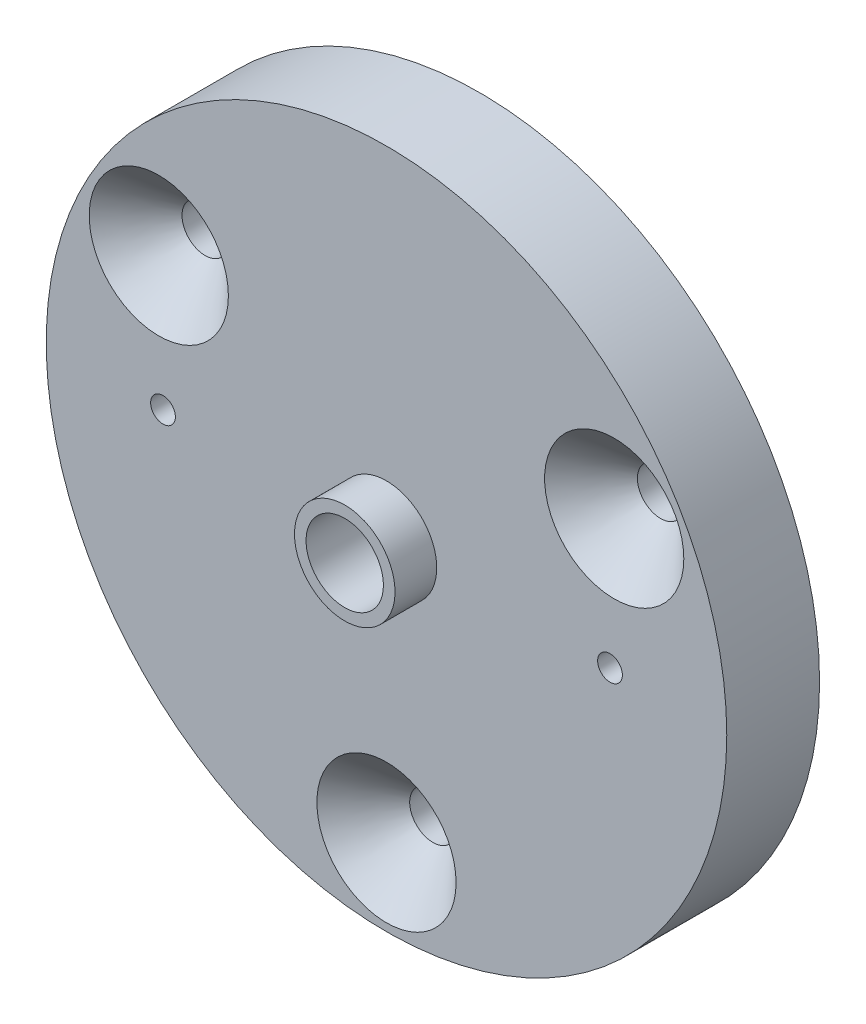
ISO-10303-21;
HEADER;
FILE_DESCRIPTION(('STEP AP214'),'2;1');
FILE_NAME('part.step','',(''),(''),'','','');
FILE_SCHEMA(('AUTOMOTIVE_DESIGN { 1 0 10303 214 1 1 1 1 }'));
ENDSEC;
DATA;
#1=APPLICATION_CONTEXT('core data for automotive mechanical design processes');
#2=APPLICATION_PROTOCOL_DEFINITION('international standard','automotive_design',2000,#1);
#3=PRODUCT_CONTEXT('',#1,'mechanical');
#4=PRODUCT('Part','Part','',(#3));
#5=PRODUCT_RELATED_PRODUCT_CATEGORY('part','',(#4));
#6=PRODUCT_DEFINITION_FORMATION('','',#4);
#7=PRODUCT_DEFINITION_CONTEXT('part definition',#1,'design');
#8=PRODUCT_DEFINITION('design','',#6,#7);
#9=PRODUCT_DEFINITION_SHAPE('','',#8);
#10=(LENGTH_UNIT() NAMED_UNIT(*) SI_UNIT(.MILLI.,.METRE.));
#11=(NAMED_UNIT(*) PLANE_ANGLE_UNIT() SI_UNIT($,.RADIAN.));
#12=(NAMED_UNIT(*) SI_UNIT($,.STERADIAN.) SOLID_ANGLE_UNIT());
#13=UNCERTAINTY_MEASURE_WITH_UNIT(LENGTH_MEASURE(1.E-05),#10,'distance_accuracy_value','');
#14=(GEOMETRIC_REPRESENTATION_CONTEXT(3) GLOBAL_UNCERTAINTY_ASSIGNED_CONTEXT((#13)) GLOBAL_UNIT_ASSIGNED_CONTEXT((#10,
#11,#12)) REPRESENTATION_CONTEXT('',''));
#15=CARTESIAN_POINT('',(0.,0.,0.));
#16=DIRECTION('',(0.,0.,1.));
#17=DIRECTION('',(1.,0.,0.));
#18=AXIS2_PLACEMENT_3D('',#15,#16,#17);
#19=CARTESIAN_POINT('',(0.,0.,0.));
#20=DIRECTION('',(0.,0.,1.));
#21=DIRECTION('',(1.,0.,0.));
#22=AXIS2_PLACEMENT_3D('',#19,#20,#21);
#23=CYLINDRICAL_SURFACE('',#22,2.5);
#24=CARTESIAN_POINT('',(0.,0.,8.7));
#25=DIRECTION('',(0.,0.,1.));
#26=DIRECTION('',(1.,0.,0.));
#27=AXIS2_PLACEMENT_3D('',#24,#25,#26);
#28=CIRCLE('',#27,2.5);
#29=CARTESIAN_POINT('',(2.5,0.,8.7));
#30=VERTEX_POINT('',#29);
#31=EDGE_CURVE('E78',#30,#30,#28,.T.);
#32=ORIENTED_EDGE('',*,*,#31,.T.);
#33=EDGE_LOOP('',(#32));
#34=FACE_BOUND('',#33,.T.);
#35=CARTESIAN_POINT('',(0.,0.,2.));
#36=DIRECTION('',(0.,0.,-1.));
#37=DIRECTION('',(-1.,0.,0.));
#38=AXIS2_PLACEMENT_3D('',#35,#36,#37);
#39=CIRCLE('',#38,2.5);
#40=CARTESIAN_POINT('',(-2.5,0.,2.));
#41=VERTEX_POINT('',#40);
#42=EDGE_CURVE('E62',#41,#41,#39,.F.);
#43=ORIENTED_EDGE('',*,*,#42,.F.);
#44=EDGE_LOOP('',(#43));
#45=FACE_BOUND('',#44,.T.);
#46=ADVANCED_FACE('F34',(#34,#45),#23,.F.);
#47=CARTESIAN_POINT('',(0.,0.,6.));
#48=DIRECTION('',(0.,0.,-1.));
#49=DIRECTION('',(-1.,0.,0.));
#50=AXIS2_PLACEMENT_3D('',#47,#48,#49);
#51=CYLINDRICAL_SURFACE('',#50,22.);
#52=CARTESIAN_POINT('',(0.,0.,6.));
#53=DIRECTION('',(0.,0.,1.));
#54=DIRECTION('',(1.,0.,0.));
#55=AXIS2_PLACEMENT_3D('',#52,#53,#54);
#56=CIRCLE('',#55,22.);
#57=CARTESIAN_POINT('',(22.,0.,6.));
#58=VERTEX_POINT('',#57);
#59=EDGE_CURVE('E70',#58,#58,#56,.T.);
#60=ORIENTED_EDGE('',*,*,#59,.F.);
#61=EDGE_LOOP('',(#60));
#62=FACE_BOUND('',#61,.T.);
#63=CARTESIAN_POINT('',(0.,0.,0.));
#64=DIRECTION('',(0.,0.,1.));
#65=DIRECTION('',(1.,0.,0.));
#66=AXIS2_PLACEMENT_3D('',#63,#64,#65);
#67=CIRCLE('',#66,22.);
#68=CARTESIAN_POINT('',(22.,0.,0.));
#69=VERTEX_POINT('',#68);
#70=EDGE_CURVE('E67',#69,#69,#67,.T.);
#71=ORIENTED_EDGE('',*,*,#70,.T.);
#72=EDGE_LOOP('',(#71));
#73=FACE_BOUND('',#72,.T.);
#74=ADVANCED_FACE('F126',(#62,#73),#51,.T.);
#75=CARTESIAN_POINT('',(0.,0.,6.));
#76=DIRECTION('',(0.,0.,1.));
#77=DIRECTION('',(1.,0.,0.));
#78=AXIS2_PLACEMENT_3D('',#75,#76,#77);
#79=PLANE('',#78);
#80=CARTESIAN_POINT('',(0.,-17.,6.));
#81=DIRECTION('',(0.,0.,1.));
#82=DIRECTION('',(1.,0.,0.));
#83=AXIS2_PLACEMENT_3D('',#80,#81,#82);
#84=CIRCLE('',#83,4.50000000000002);
#85=CARTESIAN_POINT('',(4.50000000000002,-17.,6.));
#86=VERTEX_POINT('',#85);
#87=EDGE_CURVE('E46',#86,#86,#84,.F.);
#88=ORIENTED_EDGE('',*,*,#87,.T.);
#89=EDGE_LOOP('',(#88));
#90=FACE_BOUND('',#89,.T.);
#91=CARTESIAN_POINT('',(14.7224318643355,8.49999999999986,6.));
#92=DIRECTION('',(0.,0.,1.));
#93=DIRECTION('',(1.,0.,0.));
#94=AXIS2_PLACEMENT_3D('',#91,#92,#93);
#95=CIRCLE('',#94,4.50000000000002);
#96=CARTESIAN_POINT('',(19.2224318643356,8.49999999999986,6.));
#97=VERTEX_POINT('',#96);
#98=EDGE_CURVE('E50',#97,#97,#95,.F.);
#99=ORIENTED_EDGE('',*,*,#98,.T.);
#100=EDGE_LOOP('',(#99));
#101=FACE_BOUND('',#100,.T.);
#102=CARTESIAN_POINT('',(-14.7224318643354,8.50000000000007,6.));
#103=DIRECTION('',(0.,0.,1.));
#104=DIRECTION('',(1.,0.,0.));
#105=AXIS2_PLACEMENT_3D('',#102,#103,#104);
#106=CIRCLE('',#105,4.5);
#107=CARTESIAN_POINT('',(-10.2224318643354,8.50000000000007,6.));
#108=VERTEX_POINT('',#107);
#109=EDGE_CURVE('E55',#108,#108,#106,.F.);
#110=ORIENTED_EDGE('',*,*,#109,.T.);
#111=EDGE_LOOP('',(#110));
#112=FACE_BOUND('',#111,.T.);
#113=CARTESIAN_POINT('',(-14.45,0.,6.));
#114=DIRECTION('',(0.,0.,1.));
#115=DIRECTION('',(1.,0.,0.));
#116=AXIS2_PLACEMENT_3D('',#113,#114,#115);
#117=CIRCLE('',#116,0.800000000000001);
#118=CARTESIAN_POINT('',(-13.65,0.,6.));
#119=VERTEX_POINT('',#118);
#120=EDGE_CURVE('E87',#119,#119,#117,.T.);
#121=ORIENTED_EDGE('',*,*,#120,.F.);
#122=EDGE_LOOP('',(#121));
#123=FACE_BOUND('',#122,.T.);
#124=CARTESIAN_POINT('',(14.45,0.,6.));
#125=DIRECTION('',(0.,0.,1.));
#126=DIRECTION('',(1.,0.,0.));
#127=AXIS2_PLACEMENT_3D('',#124,#125,#126);
#128=CIRCLE('',#127,0.800000000000003);
#129=CARTESIAN_POINT('',(15.25,0.,6.));
#130=VERTEX_POINT('',#129);
#131=EDGE_CURVE('E65',#130,#130,#128,.T.);
#132=ORIENTED_EDGE('',*,*,#131,.F.);
#133=EDGE_LOOP('',(#132));
#134=FACE_BOUND('',#133,.T.);
#135=CARTESIAN_POINT('',(0.,0.,6.));
#136=DIRECTION('',(0.,0.,1.));
#137=DIRECTION('',(1.,0.,0.));
#138=AXIS2_PLACEMENT_3D('',#135,#136,#137);
#139=CIRCLE('',#138,3.25);
#140=CARTESIAN_POINT('',(-3.25,0.,6.));
#141=VERTEX_POINT('',#140);
#142=EDGE_CURVE('E61',#141,#141,#139,.T.);
#143=ORIENTED_EDGE('',*,*,#142,.F.);
#144=EDGE_LOOP('',(#143));
#145=FACE_BOUND('',#144,.T.);
#146=ORIENTED_EDGE('',*,*,#59,.T.);
#147=EDGE_LOOP('',(#146));
#148=FACE_BOUND('',#147,.T.);
#149=ADVANCED_FACE('F132',(#90,#101,#112,#123,#134,#145,#148),#79,.T.);
#150=CARTESIAN_POINT('',(0.,0.,0.));
#151=DIRECTION('',(0.,0.,1.));
#152=DIRECTION('',(1.,0.,0.));
#153=AXIS2_PLACEMENT_3D('',#150,#151,#152);
#154=PLANE('',#153);
#155=CARTESIAN_POINT('',(0.,-17.,0.));
#156=DIRECTION('',(0.,0.,1.));
#157=DIRECTION('',(1.,0.,0.));
#158=AXIS2_PLACEMENT_3D('',#155,#156,#157);
#159=CIRCLE('',#158,1.5);
#160=CARTESIAN_POINT('',(1.5,-17.,0.));
#161=VERTEX_POINT('',#160);
#162=EDGE_CURVE('E95',#161,#161,#159,.T.);
#163=ORIENTED_EDGE('',*,*,#162,.T.);
#164=EDGE_LOOP('',(#163));
#165=FACE_BOUND('',#164,.T.);
#166=CARTESIAN_POINT('',(-14.7224318643354,8.50000000000007,0.));
#167=DIRECTION('',(0.,0.,1.));
#168=DIRECTION('',(1.,0.,0.));
#169=AXIS2_PLACEMENT_3D('',#166,#167,#168);
#170=CIRCLE('',#169,1.5);
#171=CARTESIAN_POINT('',(-13.2224318643354,8.50000000000007,0.));
#172=VERTEX_POINT('',#171);
#173=EDGE_CURVE('E101',#172,#172,#170,.T.);
#174=ORIENTED_EDGE('',*,*,#173,.T.);
#175=EDGE_LOOP('',(#174));
#176=FACE_BOUND('',#175,.T.);
#177=CARTESIAN_POINT('',(14.7224318643355,8.49999999999986,0.));
#178=DIRECTION('',(0.,0.,1.));
#179=DIRECTION('',(1.,0.,0.));
#180=AXIS2_PLACEMENT_3D('',#177,#178,#179);
#181=CIRCLE('',#180,1.5);
#182=CARTESIAN_POINT('',(16.2224318643355,8.49999999999986,0.));
#183=VERTEX_POINT('',#182);
#184=EDGE_CURVE('E98',#183,#183,#181,.T.);
#185=ORIENTED_EDGE('',*,*,#184,.T.);
#186=EDGE_LOOP('',(#185));
#187=FACE_BOUND('',#186,.T.);
#188=CARTESIAN_POINT('',(0.,0.,0.));
#189=DIRECTION('',(0.,0.,-1.));
#190=DIRECTION('',(-1.,0.,0.));
#191=AXIS2_PLACEMENT_3D('',#188,#189,#190);
#192=CIRCLE('',#191,13.);
#193=CARTESIAN_POINT('',(-13.,0.,0.));
#194=VERTEX_POINT('',#193);
#195=EDGE_CURVE('E92',#194,#194,#192,.T.);
#196=ORIENTED_EDGE('',*,*,#195,.F.);
#197=EDGE_LOOP('',(#196));
#198=FACE_BOUND('',#197,.T.);
#199=CARTESIAN_POINT('',(-14.45,0.,0.));
#200=DIRECTION('',(0.,0.,1.));
#201=DIRECTION('',(1.,0.,0.));
#202=AXIS2_PLACEMENT_3D('',#199,#200,#201);
#203=CIRCLE('',#202,0.800000000000001);
#204=CARTESIAN_POINT('',(-13.65,0.,0.));
#205=VERTEX_POINT('',#204);
#206=EDGE_CURVE('E81',#205,#205,#203,.T.);
#207=ORIENTED_EDGE('',*,*,#206,.T.);
#208=EDGE_LOOP('',(#207));
#209=FACE_BOUND('',#208,.T.);
#210=CARTESIAN_POINT('',(14.45,0.,0.));
#211=DIRECTION('',(0.,0.,1.));
#212=DIRECTION('',(1.,0.,0.));
#213=AXIS2_PLACEMENT_3D('',#210,#211,#212);
#214=CIRCLE('',#213,0.800000000000003);
#215=CARTESIAN_POINT('',(15.25,0.,0.));
#216=VERTEX_POINT('',#215);
#217=EDGE_CURVE('E84',#216,#216,#214,.T.);
#218=ORIENTED_EDGE('',*,*,#217,.T.);
#219=EDGE_LOOP('',(#218));
#220=FACE_BOUND('',#219,.T.);
#221=ORIENTED_EDGE('',*,*,#70,.F.);
#222=EDGE_LOOP('',(#221));
#223=FACE_BOUND('',#222,.T.);
#224=ADVANCED_FACE('F107',(#165,#176,#187,#198,#209,#220,#223),#154,.F.);
#225=CARTESIAN_POINT('',(0.,0.,8.7));
#226=DIRECTION('',(0.,0.,-1.));
#227=DIRECTION('',(-1.,0.,0.));
#228=AXIS2_PLACEMENT_3D('',#225,#226,#227);
#229=CYLINDRICAL_SURFACE('',#228,3.25);
#230=CARTESIAN_POINT('',(0.,0.,8.7));
#231=DIRECTION('',(0.,0.,1.));
#232=DIRECTION('',(1.,0.,0.));
#233=AXIS2_PLACEMENT_3D('',#230,#231,#232);
#234=CIRCLE('',#233,3.25);
#235=CARTESIAN_POINT('',(-3.25,0.,8.7));
#236=VERTEX_POINT('',#235);
#237=EDGE_CURVE('E71',#236,#236,#234,.T.);
#238=CARTESIAN_POINT('',(-3.25,0.,8.7));
#239=CARTESIAN_POINT('',(-3.25,0.,8.671875));
#240=CARTESIAN_POINT('',(-3.25,0.,8.64375));
#241=CARTESIAN_POINT('',(-3.25,0.,8.5875));
#242=CARTESIAN_POINT('',(-3.25,0.,8.559375));
#243=CARTESIAN_POINT('',(-3.25,0.,8.503125));
#244=CARTESIAN_POINT('',(-3.25,0.,8.475));
#245=CARTESIAN_POINT('',(-3.25,0.,8.41875));
#246=CARTESIAN_POINT('',(-3.25,0.,8.390625));
#247=CARTESIAN_POINT('',(-3.25,0.,8.334375));
#248=CARTESIAN_POINT('',(-3.25,0.,8.30625));
#249=CARTESIAN_POINT('',(-3.25,0.,8.25));
#250=CARTESIAN_POINT('',(-3.25,0.,8.221875));
#251=CARTESIAN_POINT('',(-3.25,0.,8.165625));
#252=CARTESIAN_POINT('',(-3.25,0.,8.1375));
#253=CARTESIAN_POINT('',(-3.25,0.,8.08125));
#254=CARTESIAN_POINT('',(-3.25,0.,8.053125));
#255=CARTESIAN_POINT('',(-3.25,0.,7.996875));
#256=CARTESIAN_POINT('',(-3.25,0.,7.96875));
#257=CARTESIAN_POINT('',(-3.25,0.,7.9125));
#258=CARTESIAN_POINT('',(-3.25,0.,7.884375));
#259=CARTESIAN_POINT('',(-3.25,0.,7.828125));
#260=CARTESIAN_POINT('',(-3.25,0.,7.8));
#261=CARTESIAN_POINT('',(-3.25,0.,7.74375));
#262=CARTESIAN_POINT('',(-3.25,0.,7.715625));
#263=CARTESIAN_POINT('',(-3.25,0.,7.659375));
#264=CARTESIAN_POINT('',(-3.25,0.,7.63125));
#265=CARTESIAN_POINT('',(-3.25,0.,7.575));
#266=CARTESIAN_POINT('',(-3.25,0.,7.546875));
#267=CARTESIAN_POINT('',(-3.25,0.,7.490625));
#268=CARTESIAN_POINT('',(-3.25,0.,7.4625));
#269=CARTESIAN_POINT('',(-3.25,0.,7.40625));
#270=CARTESIAN_POINT('',(-3.25,0.,7.378125));
#271=CARTESIAN_POINT('',(-3.25,0.,7.321875));
#272=CARTESIAN_POINT('',(-3.25,0.,7.29375));
#273=CARTESIAN_POINT('',(-3.25,0.,7.2375));
#274=CARTESIAN_POINT('',(-3.25,0.,7.209375));
#275=CARTESIAN_POINT('',(-3.25,0.,7.153125));
#276=CARTESIAN_POINT('',(-3.25,0.,7.125));
#277=CARTESIAN_POINT('',(-3.25,0.,7.06875));
#278=CARTESIAN_POINT('',(-3.25,0.,7.040625));
#279=CARTESIAN_POINT('',(-3.25,0.,6.984375));
#280=CARTESIAN_POINT('',(-3.25,0.,6.95625));
#281=CARTESIAN_POINT('',(-3.25,0.,6.9));
#282=CARTESIAN_POINT('',(-3.25,0.,6.871875));
#283=CARTESIAN_POINT('',(-3.25,0.,6.815625));
#284=CARTESIAN_POINT('',(-3.25,0.,6.7875));
#285=CARTESIAN_POINT('',(-3.25,0.,6.73125));
#286=CARTESIAN_POINT('',(-3.25,0.,6.703125));
#287=CARTESIAN_POINT('',(-3.25,0.,6.646875));
#288=CARTESIAN_POINT('',(-3.25,0.,6.61875));
#289=CARTESIAN_POINT('',(-3.25,0.,6.5625));
#290=CARTESIAN_POINT('',(-3.25,0.,6.534375));
#291=CARTESIAN_POINT('',(-3.25,0.,6.478125));
#292=CARTESIAN_POINT('',(-3.25,0.,6.45));
#293=CARTESIAN_POINT('',(-3.25,0.,6.39375));
#294=CARTESIAN_POINT('',(-3.25,0.,6.365625));
#295=CARTESIAN_POINT('',(-3.25,0.,6.309375));
#296=CARTESIAN_POINT('',(-3.25,0.,6.28125));
#297=CARTESIAN_POINT('',(-3.25,0.,6.225));
#298=CARTESIAN_POINT('',(-3.25,0.,6.196875));
#299=CARTESIAN_POINT('',(-3.25,0.,6.140625));
#300=CARTESIAN_POINT('',(-3.25,0.,6.1125));
#301=CARTESIAN_POINT('',(-3.25,0.,6.05625));
#302=CARTESIAN_POINT('',(-3.25,0.,6.028125));
#303=CARTESIAN_POINT('',(-3.25,0.,6.));
#304=B_SPLINE_CURVE_WITH_KNOTS('',3,(#238,#239,#240,#241,#242,#243,#244,#245,#246,#247,#248,
#249,#250,#251,#252,#253,#254,#255,#256,#257,#258,#259,#260,#261,#262,#263,#264,#265,#266,#267,
#268,#269,#270,#271,#272,#273,#274,#275,#276,#277,#278,#279,#280,#281,#282,#283,#284,#285,#286,
#287,#288,#289,#290,#291,#292,#293,#294,#295,#296,#297,#298,#299,#300,#301,#302,#303),
.UNSPECIFIED.,.F.,.F.,(4,2,2,2,2,2,2,2,2,2,2,2,2,2,2,2,2,2,2,2,2,2,2,2,2,2,2,2,2,2,2,2,4),(0.,
0.0843750000000011,0.168750000000001,0.253125,0.337500000000001,0.421875,0.50625,
0.590625000000001,0.675,0.759375000000001,0.843750000000001,0.928125,1.0125,1.096875,1.18125,
1.265625,1.35,1.434375,1.51875,1.603125,1.6875,1.771875,1.85625,1.940625,2.025,2.109375,2.19375,
2.278125,2.3625,2.446875,2.53125,2.615625,2.7),.UNSPECIFIED.);
#305=EDGE_CURVE('BSEAM143',#236,#141,#304,.T.);
#306=ORIENTED_EDGE('',*,*,#237,.F.);
#307=ORIENTED_EDGE('',*,*,#142,.T.);
#308=ORIENTED_EDGE('',*,*,#305,.T.);
#309=ORIENTED_EDGE('',*,*,#305,.F.);
#310=EDGE_LOOP('',(#306,#308,#307,#309));
#311=FACE_BOUND('',#310,.T.);
#312=ADVANCED_FACE('F143',(#311),#229,.T.);
#313=CARTESIAN_POINT('',(0.,0.,8.7));
#314=DIRECTION('',(0.,0.,1.));
#315=DIRECTION('',(1.,0.,0.));
#316=AXIS2_PLACEMENT_3D('',#313,#314,#315);
#317=PLANE('',#316);
#318=ORIENTED_EDGE('',*,*,#31,.F.);
#319=EDGE_LOOP('',(#318));
#320=FACE_BOUND('',#319,.T.);
#321=ORIENTED_EDGE('',*,*,#237,.T.);
#322=EDGE_LOOP('',(#321));
#323=FACE_BOUND('',#322,.T.);
#324=ADVANCED_FACE('F140',(#320,#323),#317,.T.);
#325=CARTESIAN_POINT('',(14.45,0.,0.));
#326=DIRECTION('',(0.,0.,1.));
#327=DIRECTION('',(1.,0.,0.));
#328=AXIS2_PLACEMENT_3D('',#325,#326,#327);
#329=CYLINDRICAL_SURFACE('',#328,0.800000000000003);
#330=ORIENTED_EDGE('',*,*,#217,.F.);
#331=EDGE_LOOP('',(#330));
#332=FACE_BOUND('',#331,.T.);
#333=ORIENTED_EDGE('',*,*,#131,.T.);
#334=EDGE_LOOP('',(#333));
#335=FACE_BOUND('',#334,.T.);
#336=ADVANCED_FACE('F138',(#332,#335),#329,.F.);
#337=CARTESIAN_POINT('',(-14.45,0.,0.));
#338=DIRECTION('',(0.,0.,1.));
#339=DIRECTION('',(1.,0.,0.));
#340=AXIS2_PLACEMENT_3D('',#337,#338,#339);
#341=CYLINDRICAL_SURFACE('',#340,0.800000000000001);
#342=ORIENTED_EDGE('',*,*,#206,.F.);
#343=EDGE_LOOP('',(#342));
#344=FACE_BOUND('',#343,.T.);
#345=ORIENTED_EDGE('',*,*,#120,.T.);
#346=EDGE_LOOP('',(#345));
#347=FACE_BOUND('',#346,.T.);
#348=ADVANCED_FACE('F183',(#344,#347),#341,.F.);
#349=CARTESIAN_POINT('',(0.,0.,2.));
#350=DIRECTION('',(0.,0.,-1.));
#351=DIRECTION('',(-1.,0.,0.));
#352=AXIS2_PLACEMENT_3D('',#349,#350,#351);
#353=PLANE('',#352);
#354=CARTESIAN_POINT('',(0.,0.,2.));
#355=DIRECTION('',(0.,0.,-1.));
#356=DIRECTION('',(-1.,0.,0.));
#357=AXIS2_PLACEMENT_3D('',#354,#355,#356);
#358=CIRCLE('',#357,13.);
#359=CARTESIAN_POINT('',(-13.,0.,2.));
#360=VERTEX_POINT('',#359);
#361=EDGE_CURVE('E66',#360,#360,#358,.T.);
#362=ORIENTED_EDGE('',*,*,#361,.T.);
#363=EDGE_LOOP('',(#362));
#364=FACE_BOUND('',#363,.T.);
#365=ORIENTED_EDGE('',*,*,#42,.T.);
#366=EDGE_LOOP('',(#365));
#367=FACE_BOUND('',#366,.T.);
#368=ADVANCED_FACE('F188',(#364,#367),#353,.T.);
#369=CARTESIAN_POINT('',(0.,0.,2.));
#370=DIRECTION('',(0.,0.,-1.));
#371=DIRECTION('',(-1.,0.,0.));
#372=AXIS2_PLACEMENT_3D('',#369,#370,#371);
#373=CYLINDRICAL_SURFACE('',#372,13.);
#374=ORIENTED_EDGE('',*,*,#361,.F.);
#375=EDGE_LOOP('',(#374));
#376=FACE_BOUND('',#375,.T.);
#377=ORIENTED_EDGE('',*,*,#195,.T.);
#378=EDGE_LOOP('',(#377));
#379=FACE_BOUND('',#378,.T.);
#380=ADVANCED_FACE('F195',(#376,#379),#373,.F.);
#381=CARTESIAN_POINT('',(14.7224318643355,8.49999999999986,0.));
#382=DIRECTION('',(0.,0.,1.));
#383=DIRECTION('',(1.,0.,0.));
#384=AXIS2_PLACEMENT_3D('',#381,#382,#383);
#385=CYLINDRICAL_SURFACE('',#384,1.5);
#386=CARTESIAN_POINT('',(14.7224318643355,8.49999999999986,3.));
#387=DIRECTION('',(0.,0.,1.));
#388=DIRECTION('',(1.,0.,0.));
#389=AXIS2_PLACEMENT_3D('',#386,#387,#388);
#390=CIRCLE('',#389,1.5);
#391=CARTESIAN_POINT('',(16.2224318643355,8.49999999999986,3.));
#392=VERTEX_POINT('',#391);
#393=EDGE_CURVE('E42',#392,#392,#390,.T.);
#394=ORIENTED_EDGE('',*,*,#393,.T.);
#395=EDGE_LOOP('',(#394));
#396=FACE_BOUND('',#395,.T.);
#397=ORIENTED_EDGE('',*,*,#184,.F.);
#398=EDGE_LOOP('',(#397));
#399=FACE_BOUND('',#398,.T.);
#400=ADVANCED_FACE('F123',(#396,#399),#385,.F.);
#401=CARTESIAN_POINT('',(-14.7224318643354,8.50000000000007,0.));
#402=DIRECTION('',(0.,0.,1.));
#403=DIRECTION('',(1.,0.,0.));
#404=AXIS2_PLACEMENT_3D('',#401,#402,#403);
#405=CYLINDRICAL_SURFACE('',#404,1.5);
#406=CARTESIAN_POINT('',(-14.7224318643354,8.50000000000007,3.));
#407=DIRECTION('',(0.,0.,1.));
#408=DIRECTION('',(1.,0.,0.));
#409=AXIS2_PLACEMENT_3D('',#406,#407,#408);
#410=CIRCLE('',#409,1.5);
#411=CARTESIAN_POINT('',(-13.2224318643354,8.50000000000007,3.));
#412=VERTEX_POINT('',#411);
#413=EDGE_CURVE('E10',#412,#412,#410,.T.);
#414=ORIENTED_EDGE('',*,*,#413,.T.);
#415=EDGE_LOOP('',(#414));
#416=FACE_BOUND('',#415,.T.);
#417=ORIENTED_EDGE('',*,*,#173,.F.);
#418=EDGE_LOOP('',(#417));
#419=FACE_BOUND('',#418,.T.);
#420=ADVANCED_FACE('F113',(#416,#419),#405,.F.);
#421=CARTESIAN_POINT('',(0.,-17.,0.));
#422=DIRECTION('',(0.,0.,1.));
#423=DIRECTION('',(1.,0.,0.));
#424=AXIS2_PLACEMENT_3D('',#421,#422,#423);
#425=CYLINDRICAL_SURFACE('',#424,1.5);
#426=CARTESIAN_POINT('',(0.,-17.,3.));
#427=DIRECTION('',(0.,0.,1.));
#428=DIRECTION('',(1.,0.,0.));
#429=AXIS2_PLACEMENT_3D('',#426,#427,#428);
#430=CIRCLE('',#429,1.5);
#431=CARTESIAN_POINT('',(1.5,-17.,3.));
#432=VERTEX_POINT('',#431);
#433=EDGE_CURVE('E58',#432,#432,#430,.T.);
#434=ORIENTED_EDGE('',*,*,#433,.T.);
#435=EDGE_LOOP('',(#434));
#436=FACE_BOUND('',#435,.T.);
#437=ORIENTED_EDGE('',*,*,#162,.F.);
#438=EDGE_LOOP('',(#437));
#439=FACE_BOUND('',#438,.T.);
#440=ADVANCED_FACE('F110',(#436,#439),#425,.F.);
#441=CARTESIAN_POINT('',(0.,-17.,3.));
#442=DIRECTION('',(0.,0.,1.));
#443=DIRECTION('',(1.,0.,0.));
#444=AXIS2_PLACEMENT_3D('',#441,#442,#443);
#445=CONICAL_SURFACE('',#444,1.5,0.785398163397451);
#446=CARTESIAN_POINT('',(4.50000000000002,-17.,6.));
#447=CARTESIAN_POINT('',(4.46875000000002,-17.,5.96875));
#448=CARTESIAN_POINT('',(4.43750000000002,-17.,5.9375));
#449=CARTESIAN_POINT('',(4.37500000000002,-17.,5.875));
#450=CARTESIAN_POINT('',(4.34375000000002,-17.,5.84375));
#451=CARTESIAN_POINT('',(4.28125000000002,-17.,5.78125));
#452=CARTESIAN_POINT('',(4.25000000000002,-17.,5.75));
#453=CARTESIAN_POINT('',(4.18750000000002,-17.,5.6875));
#454=CARTESIAN_POINT('',(4.15625000000001,-17.,5.65625));
#455=CARTESIAN_POINT('',(4.09375000000001,-17.,5.59375));
#456=CARTESIAN_POINT('',(4.06250000000001,-17.,5.5625));
#457=CARTESIAN_POINT('',(4.00000000000001,-17.,5.5));
#458=CARTESIAN_POINT('',(3.96875000000001,-17.,5.46875));
#459=CARTESIAN_POINT('',(3.90625000000001,-17.,5.40625));
#460=CARTESIAN_POINT('',(3.87500000000001,-17.,5.375));
#461=CARTESIAN_POINT('',(3.81250000000001,-17.,5.3125));
#462=CARTESIAN_POINT('',(3.78125000000001,-17.,5.28125));
#463=CARTESIAN_POINT('',(3.71875000000001,-17.,5.21875));
#464=CARTESIAN_POINT('',(3.68750000000001,-17.,5.1875));
#465=CARTESIAN_POINT('',(3.62500000000001,-17.,5.125));
#466=CARTESIAN_POINT('',(3.59375000000001,-17.,5.09375));
#467=CARTESIAN_POINT('',(3.53125000000001,-17.,5.03125));
#468=CARTESIAN_POINT('',(3.50000000000001,-17.,5.));
#469=CARTESIAN_POINT('',(3.43750000000001,-17.,4.9375));
#470=CARTESIAN_POINT('',(3.40625000000001,-17.,4.90625));
#471=CARTESIAN_POINT('',(3.34375000000001,-17.,4.84375));
#472=CARTESIAN_POINT('',(3.31250000000001,-17.,4.8125));
#473=CARTESIAN_POINT('',(3.25000000000001,-17.,4.75));
#474=CARTESIAN_POINT('',(3.21875000000001,-17.,4.71875));
#475=CARTESIAN_POINT('',(3.15625000000001,-17.,4.65625));
#476=CARTESIAN_POINT('',(3.12500000000001,-17.,4.625));
#477=CARTESIAN_POINT('',(3.06250000000001,-17.,4.5625));
#478=CARTESIAN_POINT('',(3.03125000000001,-17.,4.53125));
#479=CARTESIAN_POINT('',(2.96875000000001,-17.,4.46875));
#480=CARTESIAN_POINT('',(2.93750000000001,-17.,4.4375));
#481=CARTESIAN_POINT('',(2.87500000000001,-17.,4.375));
#482=CARTESIAN_POINT('',(2.84375000000001,-17.,4.34375));
#483=CARTESIAN_POINT('',(2.78125000000001,-17.,4.28125));
#484=CARTESIAN_POINT('',(2.75000000000001,-17.,4.25));
#485=CARTESIAN_POINT('',(2.68750000000001,-17.,4.1875));
#486=CARTESIAN_POINT('',(2.65625000000001,-17.,4.15625));
#487=CARTESIAN_POINT('',(2.59375000000001,-17.,4.09375));
#488=CARTESIAN_POINT('',(2.56250000000001,-17.,4.0625));
#489=CARTESIAN_POINT('',(2.50000000000001,-17.,4.));
#490=CARTESIAN_POINT('',(2.46875000000001,-17.,3.96875));
#491=CARTESIAN_POINT('',(2.40625000000001,-17.,3.90625));
#492=CARTESIAN_POINT('',(2.375,-17.,3.875));
#493=CARTESIAN_POINT('',(2.3125,-17.,3.8125));
#494=CARTESIAN_POINT('',(2.28125,-17.,3.78125));
#495=CARTESIAN_POINT('',(2.21875,-17.,3.71875));
#496=CARTESIAN_POINT('',(2.1875,-17.,3.6875));
#497=CARTESIAN_POINT('',(2.125,-17.,3.625));
#498=CARTESIAN_POINT('',(2.09375,-17.,3.59375));
#499=CARTESIAN_POINT('',(2.03125,-17.,3.53125));
#500=CARTESIAN_POINT('',(2.,-17.,3.5));
#501=CARTESIAN_POINT('',(1.9375,-17.,3.4375));
#502=CARTESIAN_POINT('',(1.90625,-17.,3.40625));
#503=CARTESIAN_POINT('',(1.84375,-17.,3.34375));
#504=CARTESIAN_POINT('',(1.8125,-17.,3.3125));
#505=CARTESIAN_POINT('',(1.75,-17.,3.25));
#506=CARTESIAN_POINT('',(1.71875,-17.,3.21875));
#507=CARTESIAN_POINT('',(1.65625,-17.,3.15625));
#508=CARTESIAN_POINT('',(1.625,-17.,3.125));
#509=CARTESIAN_POINT('',(1.5625,-17.,3.0625));
#510=CARTESIAN_POINT('',(1.53125,-17.,3.03125));
#511=CARTESIAN_POINT('',(1.5,-17.,3.));
#512=B_SPLINE_CURVE_WITH_KNOTS('',3,(#446,#447,#448,#449,#450,#451,#452,#453,#454,#455,#456,
#457,#458,#459,#460,#461,#462,#463,#464,#465,#466,#467,#468,#469,#470,#471,#472,#473,#474,#475,
#476,#477,#478,#479,#480,#481,#482,#483,#484,#485,#486,#487,#488,#489,#490,#491,#492,#493,#494,
#495,#496,#497,#498,#499,#500,#501,#502,#503,#504,#505,#506,#507,#508,#509,#510,#511),
.UNSPECIFIED.,.F.,.F.,(4,2,2,2,2,2,2,2,2,2,2,2,2,2,2,2,2,2,2,2,2,2,2,2,2,2,2,2,2,2,2,2,4),(0.,
0.132582521472478,0.265165042944956,0.397747564417434,0.530330085889912,0.66291260736239,
0.795495128834868,0.928077650307345,1.06066017177982,1.1932426932523,1.32582521472478,
1.45840773619726,1.59099025766974,1.72357277914221,1.85615530061469,1.98873782208717,
2.12132034355965,2.25390286503213,2.3864853865046,2.51906790797708,2.65165042944956,
2.78423295092204,2.91681547239452,3.04939799386699,3.18198051533947,3.31456303681195,
3.44714555828443,3.57972807975691,3.71231060122939,3.84489312270186,3.97747564417434,
4.11005816564682,4.2426406871193),.UNSPECIFIED.);
#513=EDGE_CURVE('BSEAM112',#86,#432,#512,.T.);
#514=ORIENTED_EDGE('',*,*,#87,.F.);
#515=ORIENTED_EDGE('',*,*,#433,.F.);
#516=ORIENTED_EDGE('',*,*,#513,.T.);
#517=ORIENTED_EDGE('',*,*,#513,.F.);
#518=EDGE_LOOP('',(#514,#516,#515,#517));
#519=FACE_BOUND('',#518,.T.);
#520=ADVANCED_FACE('F112',(#519),#445,.F.);
#521=CARTESIAN_POINT('',(14.7224318643355,8.49999999999986,3.));
#522=DIRECTION('',(0.,0.,1.));
#523=DIRECTION('',(1.,0.,0.));
#524=AXIS2_PLACEMENT_3D('',#521,#522,#523);
#525=CONICAL_SURFACE('',#524,1.5,0.785398163397451);
#526=CARTESIAN_POINT('',(19.2224318643356,8.49999999999986,6.));
#527=CARTESIAN_POINT('',(19.1911818643355,8.49999999999986,5.96875));
#528=CARTESIAN_POINT('',(19.1599318643355,8.49999999999986,5.9375));
#529=CARTESIAN_POINT('',(19.0974318643355,8.49999999999986,5.875));
#530=CARTESIAN_POINT('',(19.0661818643356,8.49999999999986,5.84375));
#531=CARTESIAN_POINT('',(19.0036818643356,8.49999999999986,5.78125));
#532=CARTESIAN_POINT('',(18.9724318643355,8.49999999999986,5.75));
#533=CARTESIAN_POINT('',(18.9099318643355,8.49999999999986,5.6875));
#534=CARTESIAN_POINT('',(18.8786818643355,8.49999999999986,5.65625));
#535=CARTESIAN_POINT('',(18.8161818643355,8.49999999999986,5.59375));
#536=CARTESIAN_POINT('',(18.7849318643355,8.49999999999986,5.5625));
#537=CARTESIAN_POINT('',(18.7224318643355,8.49999999999986,5.5));
#538=CARTESIAN_POINT('',(18.6911818643355,8.49999999999986,5.46875));
#539=CARTESIAN_POINT('',(18.6286818643355,8.49999999999986,5.40625));
#540=CARTESIAN_POINT('',(18.5974318643355,8.49999999999986,5.375));
#541=CARTESIAN_POINT('',(18.5349318643355,8.49999999999986,5.3125));
#542=CARTESIAN_POINT('',(18.5036818643355,8.49999999999986,5.28125));
#543=CARTESIAN_POINT('',(18.4411818643355,8.49999999999986,5.21875));
#544=CARTESIAN_POINT('',(18.4099318643355,8.49999999999986,5.1875));
#545=CARTESIAN_POINT('',(18.3474318643355,8.49999999999986,5.125));
#546=CARTESIAN_POINT('',(18.3161818643355,8.49999999999986,5.09375));
#547=CARTESIAN_POINT('',(18.2536818643355,8.49999999999986,5.03125));
#548=CARTESIAN_POINT('',(18.2224318643355,8.49999999999986,5.));
#549=CARTESIAN_POINT('',(18.1599318643355,8.49999999999986,4.9375));
#550=CARTESIAN_POINT('',(18.1286818643355,8.49999999999986,4.90625));
#551=CARTESIAN_POINT('',(18.0661818643355,8.49999999999986,4.84375));
#552=CARTESIAN_POINT('',(18.0349318643355,8.49999999999986,4.8125));
#553=CARTESIAN_POINT('',(17.9724318643355,8.49999999999986,4.75));
#554=CARTESIAN_POINT('',(17.9411818643355,8.49999999999986,4.71875));
#555=CARTESIAN_POINT('',(17.8786818643355,8.49999999999986,4.65625));
#556=CARTESIAN_POINT('',(17.8474318643355,8.49999999999986,4.625));
#557=CARTESIAN_POINT('',(17.7849318643355,8.49999999999986,4.5625));
#558=CARTESIAN_POINT('',(17.7536818643355,8.49999999999986,4.53125));
#559=CARTESIAN_POINT('',(17.6911818643355,8.49999999999986,4.46875));
#560=CARTESIAN_POINT('',(17.6599318643355,8.49999999999986,4.4375));
#561=CARTESIAN_POINT('',(17.5974318643355,8.49999999999986,4.375));
#562=CARTESIAN_POINT('',(17.5661818643355,8.49999999999986,4.34375));
#563=CARTESIAN_POINT('',(17.5036818643355,8.49999999999986,4.28125));
#564=CARTESIAN_POINT('',(17.4724318643355,8.49999999999986,4.25));
#565=CARTESIAN_POINT('',(17.4099318643355,8.49999999999986,4.1875));
#566=CARTESIAN_POINT('',(17.3786818643355,8.49999999999986,4.15625));
#567=CARTESIAN_POINT('',(17.3161818643355,8.49999999999986,4.09375));
#568=CARTESIAN_POINT('',(17.2849318643355,8.49999999999986,4.0625));
#569=CARTESIAN_POINT('',(17.2224318643355,8.49999999999986,4.));
#570=CARTESIAN_POINT('',(17.1911818643355,8.49999999999986,3.96875));
#571=CARTESIAN_POINT('',(17.1286818643355,8.49999999999986,3.90625));
#572=CARTESIAN_POINT('',(17.0974318643355,8.49999999999986,3.875));
#573=CARTESIAN_POINT('',(17.0349318643355,8.49999999999986,3.8125));
#574=CARTESIAN_POINT('',(17.0036818643355,8.49999999999986,3.78125));
#575=CARTESIAN_POINT('',(16.9411818643355,8.49999999999986,3.71875));
#576=CARTESIAN_POINT('',(16.9099318643355,8.49999999999986,3.6875));
#577=CARTESIAN_POINT('',(16.8474318643355,8.49999999999986,3.625));
#578=CARTESIAN_POINT('',(16.8161818643355,8.49999999999986,3.59375));
#579=CARTESIAN_POINT('',(16.7536818643355,8.49999999999986,3.53125));
#580=CARTESIAN_POINT('',(16.7224318643355,8.49999999999986,3.5));
#581=CARTESIAN_POINT('',(16.6599318643355,8.49999999999986,3.4375));
#582=CARTESIAN_POINT('',(16.6286818643355,8.49999999999986,3.40625));
#583=CARTESIAN_POINT('',(16.5661818643355,8.49999999999986,3.34375));
#584=CARTESIAN_POINT('',(16.5349318643355,8.49999999999986,3.3125));
#585=CARTESIAN_POINT('',(16.4724318643355,8.49999999999986,3.25));
#586=CARTESIAN_POINT('',(16.4411818643355,8.49999999999986,3.21875));
#587=CARTESIAN_POINT('',(16.3786818643355,8.49999999999986,3.15625));
#588=CARTESIAN_POINT('',(16.3474318643355,8.49999999999986,3.125));
#589=CARTESIAN_POINT('',(16.2849318643355,8.49999999999986,3.0625));
#590=CARTESIAN_POINT('',(16.2536818643355,8.49999999999986,3.03125));
#591=CARTESIAN_POINT('',(16.2224318643355,8.49999999999986,3.));
#592=B_SPLINE_CURVE_WITH_KNOTS('',3,(#526,#527,#528,#529,#530,#531,#532,#533,#534,#535,#536,
#537,#538,#539,#540,#541,#542,#543,#544,#545,#546,#547,#548,#549,#550,#551,#552,#553,#554,#555,
#556,#557,#558,#559,#560,#561,#562,#563,#564,#565,#566,#567,#568,#569,#570,#571,#572,#573,#574,
#575,#576,#577,#578,#579,#580,#581,#582,#583,#584,#585,#586,#587,#588,#589,#590,#591),
.UNSPECIFIED.,.F.,.F.,(4,2,2,2,2,2,2,2,2,2,2,2,2,2,2,2,2,2,2,2,2,2,2,2,2,2,2,2,2,2,2,2,4),(0.,
0.13258252147248,0.265165042944956,0.397747564417436,0.530330085889913,0.662912607362391,
0.795495128834869,0.928077650307346,1.06066017177982,1.1932426932523,1.32582521472478,
1.45840773619726,1.59099025766974,1.72357277914222,1.85615530061469,1.98873782208717,
2.12132034355965,2.25390286503213,2.3864853865046,2.51906790797708,2.65165042944956,
2.78423295092204,2.91681547239452,3.04939799386699,3.18198051533947,3.31456303681195,
3.44714555828443,3.57972807975691,3.71231060122938,3.84489312270186,3.97747564417434,
4.11005816564682,4.2426406871193),.UNSPECIFIED.);
#593=EDGE_CURVE('BSEAM120',#97,#392,#592,.T.);
#594=ORIENTED_EDGE('',*,*,#98,.F.);
#595=ORIENTED_EDGE('',*,*,#393,.F.);
#596=ORIENTED_EDGE('',*,*,#593,.T.);
#597=ORIENTED_EDGE('',*,*,#593,.F.);
#598=EDGE_LOOP('',(#594,#596,#595,#597));
#599=FACE_BOUND('',#598,.T.);
#600=ADVANCED_FACE('F120',(#599),#525,.F.);
#601=CARTESIAN_POINT('',(-14.7224318643354,8.50000000000007,3.));
#602=DIRECTION('',(0.,0.,1.));
#603=DIRECTION('',(1.,0.,0.));
#604=AXIS2_PLACEMENT_3D('',#601,#602,#603);
#605=CONICAL_SURFACE('',#604,1.5,0.785398163397449);
#606=CARTESIAN_POINT('',(-10.2224318643354,8.50000000000007,6.));
#607=CARTESIAN_POINT('',(-10.2536818643354,8.50000000000007,5.96875));
#608=CARTESIAN_POINT('',(-10.2849318643354,8.50000000000007,5.9375));
#609=CARTESIAN_POINT('',(-10.3474318643354,8.50000000000007,5.875));
#610=CARTESIAN_POINT('',(-10.3786818643354,8.50000000000007,5.84375));
#611=CARTESIAN_POINT('',(-10.4411818643354,8.50000000000007,5.78125));
#612=CARTESIAN_POINT('',(-10.4724318643354,8.50000000000007,5.75));
#613=CARTESIAN_POINT('',(-10.5349318643354,8.50000000000007,5.6875));
#614=CARTESIAN_POINT('',(-10.5661818643354,8.50000000000007,5.65625));
#615=CARTESIAN_POINT('',(-10.6286818643354,8.50000000000007,5.59375));
#616=CARTESIAN_POINT('',(-10.6599318643354,8.50000000000007,5.5625));
#617=CARTESIAN_POINT('',(-10.7224318643354,8.50000000000007,5.5));
#618=CARTESIAN_POINT('',(-10.7536818643354,8.50000000000007,5.46875));
#619=CARTESIAN_POINT('',(-10.8161818643354,8.50000000000007,5.40625));
#620=CARTESIAN_POINT('',(-10.8474318643354,8.50000000000007,5.375));
#621=CARTESIAN_POINT('',(-10.9099318643354,8.50000000000007,5.3125));
#622=CARTESIAN_POINT('',(-10.9411818643354,8.50000000000007,5.28125));
#623=CARTESIAN_POINT('',(-11.0036818643354,8.50000000000007,5.21875));
#624=CARTESIAN_POINT('',(-11.0349318643354,8.50000000000007,5.1875));
#625=CARTESIAN_POINT('',(-11.0974318643354,8.50000000000007,5.125));
#626=CARTESIAN_POINT('',(-11.1286818643354,8.50000000000007,5.09375));
#627=CARTESIAN_POINT('',(-11.1911818643354,8.50000000000007,5.03125));
#628=CARTESIAN_POINT('',(-11.2224318643354,8.50000000000007,5.));
#629=CARTESIAN_POINT('',(-11.2849318643354,8.50000000000007,4.9375));
#630=CARTESIAN_POINT('',(-11.3161818643354,8.50000000000007,4.90625));
#631=CARTESIAN_POINT('',(-11.3786818643354,8.50000000000007,4.84375));
#632=CARTESIAN_POINT('',(-11.4099318643354,8.50000000000007,4.8125));
#633=CARTESIAN_POINT('',(-11.4724318643354,8.50000000000007,4.75));
#634=CARTESIAN_POINT('',(-11.5036818643354,8.50000000000007,4.71875));
#635=CARTESIAN_POINT('',(-11.5661818643354,8.50000000000007,4.65625));
#636=CARTESIAN_POINT('',(-11.5974318643354,8.50000000000007,4.625));
#637=CARTESIAN_POINT('',(-11.6599318643354,8.50000000000007,4.5625));
#638=CARTESIAN_POINT('',(-11.6911818643354,8.50000000000007,4.53125));
#639=CARTESIAN_POINT('',(-11.7536818643354,8.50000000000007,4.46875));
#640=CARTESIAN_POINT('',(-11.7849318643354,8.50000000000007,4.4375));
#641=CARTESIAN_POINT('',(-11.8474318643354,8.50000000000007,4.375));
#642=CARTESIAN_POINT('',(-11.8786818643354,8.50000000000007,4.34375));
#643=CARTESIAN_POINT('',(-11.9411818643354,8.50000000000007,4.28125));
#644=CARTESIAN_POINT('',(-11.9724318643354,8.50000000000007,4.25));
#645=CARTESIAN_POINT('',(-12.0349318643354,8.50000000000007,4.1875));
#646=CARTESIAN_POINT('',(-12.0661818643354,8.50000000000007,4.15625));
#647=CARTESIAN_POINT('',(-12.1286818643354,8.50000000000007,4.09375));
#648=CARTESIAN_POINT('',(-12.1599318643354,8.50000000000007,4.0625));
#649=CARTESIAN_POINT('',(-12.2224318643354,8.50000000000007,4.));
#650=CARTESIAN_POINT('',(-12.2536818643354,8.50000000000007,3.96875));
#651=CARTESIAN_POINT('',(-12.3161818643354,8.50000000000007,3.90625));
#652=CARTESIAN_POINT('',(-12.3474318643354,8.50000000000007,3.875));
#653=CARTESIAN_POINT('',(-12.4099318643354,8.50000000000007,3.8125));
#654=CARTESIAN_POINT('',(-12.4411818643354,8.50000000000007,3.78125));
#655=CARTESIAN_POINT('',(-12.5036818643354,8.50000000000007,3.71875));
#656=CARTESIAN_POINT('',(-12.5349318643354,8.50000000000007,3.6875));
#657=CARTESIAN_POINT('',(-12.5974318643354,8.50000000000007,3.625));
#658=CARTESIAN_POINT('',(-12.6286818643354,8.50000000000007,3.59375));
#659=CARTESIAN_POINT('',(-12.6911818643354,8.50000000000007,3.53125));
#660=CARTESIAN_POINT('',(-12.7224318643354,8.50000000000007,3.5));
#661=CARTESIAN_POINT('',(-12.7849318643354,8.50000000000007,3.4375));
#662=CARTESIAN_POINT('',(-12.8161818643354,8.50000000000007,3.40625));
#663=CARTESIAN_POINT('',(-12.8786818643354,8.50000000000007,3.34375));
#664=CARTESIAN_POINT('',(-12.9099318643354,8.50000000000007,3.3125));
#665=CARTESIAN_POINT('',(-12.9724318643354,8.50000000000007,3.25));
#666=CARTESIAN_POINT('',(-13.0036818643354,8.50000000000007,3.21875));
#667=CARTESIAN_POINT('',(-13.0661818643354,8.50000000000007,3.15625));
#668=CARTESIAN_POINT('',(-13.0974318643354,8.50000000000007,3.125));
#669=CARTESIAN_POINT('',(-13.1599318643354,8.50000000000007,3.0625));
#670=CARTESIAN_POINT('',(-13.1911818643354,8.50000000000007,3.03125));
#671=CARTESIAN_POINT('',(-13.2224318643354,8.50000000000007,3.));
#672=B_SPLINE_CURVE_WITH_KNOTS('',3,(#606,#607,#608,#609,#610,#611,#612,#613,#614,#615,#616,
#617,#618,#619,#620,#621,#622,#623,#624,#625,#626,#627,#628,#629,#630,#631,#632,#633,#634,#635,
#636,#637,#638,#639,#640,#641,#642,#643,#644,#645,#646,#647,#648,#649,#650,#651,#652,#653,#654,
#655,#656,#657,#658,#659,#660,#661,#662,#663,#664,#665,#666,#667,#668,#669,#670,#671),
.UNSPECIFIED.,.F.,.F.,(4,2,2,2,2,2,2,2,2,2,2,2,2,2,2,2,2,2,2,2,2,2,2,2,2,2,2,2,2,2,2,2,4),(0.,
0.132582521472478,0.265165042944956,0.397747564417433,0.530330085889911,0.662912607362388,
0.795495128834866,0.928077650307343,1.06066017177982,1.1932426932523,1.32582521472478,
1.45840773619725,1.59099025766973,1.72357277914221,1.85615530061469,1.98873782208716,
2.12132034355964,2.25390286503212,2.3864853865046,2.51906790797708,2.65165042944955,
2.78423295092203,2.91681547239451,3.04939799386699,3.18198051533946,3.31456303681194,
3.44714555828442,3.5797280797569,3.71231060122937,3.84489312270185,3.97747564417433,
4.11005816564681,4.24264068711928),.UNSPECIFIED.);
#673=EDGE_CURVE('BSEAM37',#108,#412,#672,.T.);
#674=ORIENTED_EDGE('',*,*,#109,.F.);
#675=ORIENTED_EDGE('',*,*,#413,.F.);
#676=ORIENTED_EDGE('',*,*,#673,.T.);
#677=ORIENTED_EDGE('',*,*,#673,.F.);
#678=EDGE_LOOP('',(#674,#676,#675,#677));
#679=FACE_BOUND('',#678,.T.);
#680=ADVANCED_FACE('F37',(#679),#605,.F.);
#681=CLOSED_SHELL('',(#46,#74,#149,#224,#312,#324,#336,#348,#368,#380,#400,#420,#440,#520,#600,#680));
#682=MANIFOLD_SOLID_BREP('B2',#681);
#683=ADVANCED_BREP_SHAPE_REPRESENTATION('',(#18,#682),#14);
#684=SHAPE_DEFINITION_REPRESENTATION(#9,#683);
ENDSEC;
END-ISO-10303-21;
